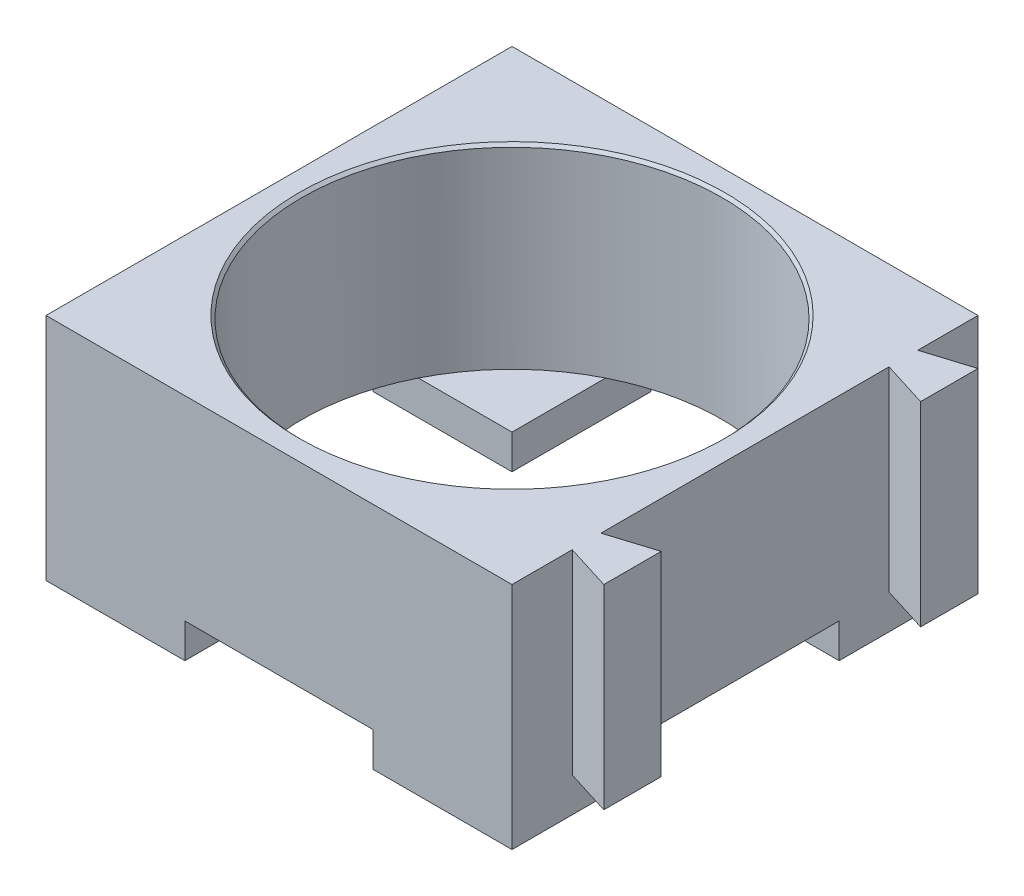
ISO-10303-21;
HEADER;
FILE_DESCRIPTION(('STEP AP214'),'2;1');
FILE_NAME('part.step','',(''),(''),'','','');
FILE_SCHEMA(('AUTOMOTIVE_DESIGN { 1 0 10303 214 1 1 1 1 }'));
ENDSEC;
DATA;
#1=APPLICATION_CONTEXT('core data for automotive mechanical design processes');
#2=APPLICATION_PROTOCOL_DEFINITION('international standard','automotive_design',2000,#1);
#3=PRODUCT_CONTEXT('',#1,'mechanical');
#4=PRODUCT('Part','Part','',(#3));
#5=PRODUCT_RELATED_PRODUCT_CATEGORY('part','',(#4));
#6=PRODUCT_DEFINITION_FORMATION('','',#4);
#7=PRODUCT_DEFINITION_CONTEXT('part definition',#1,'design');
#8=PRODUCT_DEFINITION('design','',#6,#7);
#9=PRODUCT_DEFINITION_SHAPE('','',#8);
#10=(LENGTH_UNIT() NAMED_UNIT(*) SI_UNIT(.MILLI.,.METRE.));
#11=(NAMED_UNIT(*) PLANE_ANGLE_UNIT() SI_UNIT($,.RADIAN.));
#12=(NAMED_UNIT(*) SI_UNIT($,.STERADIAN.) SOLID_ANGLE_UNIT());
#13=UNCERTAINTY_MEASURE_WITH_UNIT(LENGTH_MEASURE(1.E-05),#10,'distance_accuracy_value','');
#14=(GEOMETRIC_REPRESENTATION_CONTEXT(3) GLOBAL_UNCERTAINTY_ASSIGNED_CONTEXT((#13)) GLOBAL_UNIT_ASSIGNED_CONTEXT((#10,
#11,#12)) REPRESENTATION_CONTEXT('',''));
#15=CARTESIAN_POINT('',(0.,0.,0.));
#16=DIRECTION('',(0.,0.,1.));
#17=DIRECTION('',(1.,0.,0.));
#18=AXIS2_PLACEMENT_3D('',#15,#16,#17);
#19=CARTESIAN_POINT('',(0.,0.,0.));
#20=DIRECTION('',(0.,1.,0.));
#21=DIRECTION('',(0.,0.,1.));
#22=AXIS2_PLACEMENT_3D('',#19,#20,#21);
#23=PLANE('',#22);
#24=DIRECTION('',(0.,0.,1.));
#25=VECTOR('',#24,1.);
#26=CARTESIAN_POINT('',(10.15,0.,-10.15));
#27=LINE('',#26,#25);
#28=CARTESIAN_POINT('',(10.15,0.,-7.525));
#29=VERTEX_POINT('',#28);
#30=CARTESIAN_POINT('',(10.15,0.,-6.275));
#31=VERTEX_POINT('',#30);
#32=EDGE_CURVE('E489',#29,#31,#27,.T.);
#33=ORIENTED_EDGE('',*,*,#32,.F.);
#34=DIRECTION('',(-0.954479978035031,0.,0.298274993135942));
#35=VECTOR('',#34,1.);
#36=CARTESIAN_POINT('',(12.15,0.,-8.15));
#37=LINE('',#36,#35);
#38=CARTESIAN_POINT('',(12.15,0.,-8.15));
#39=VERTEX_POINT('',#38);
#40=EDGE_CURVE('E376',#39,#29,#37,.T.);
#41=ORIENTED_EDGE('',*,*,#40,.F.);
#42=DIRECTION('',(0.,0.,-1.));
#43=VECTOR('',#42,1.);
#44=CARTESIAN_POINT('',(12.15,0.,-8.15));
#45=LINE('',#44,#43);
#46=CARTESIAN_POINT('',(12.15,0.,-5.65));
#47=VERTEX_POINT('',#46);
#48=EDGE_CURVE('E374',#47,#39,#45,.T.);
#49=ORIENTED_EDGE('',*,*,#48,.F.);
#50=DIRECTION('',(0.954479978035029,0.,0.298274993135948));
#51=VECTOR('',#50,1.);
#52=CARTESIAN_POINT('',(12.15,0.,-5.65));
#53=LINE('',#52,#51);
#54=EDGE_CURVE('E372',#31,#47,#53,.T.);
#55=ORIENTED_EDGE('',*,*,#54,.F.);
#56=EDGE_LOOP('',(#33,#41,#49,#55));
#57=FACE_BOUND('',#56,.T.);
#58=ADVANCED_FACE('F33',(#57),#23,.F.);
#59=DIRECTION('',(-1.,0.,0.));
#60=VECTOR('',#59,1.);
#61=CARTESIAN_POINT('',(10.15,0.,-4.1));
#62=LINE('',#61,#60);
#63=CARTESIAN_POINT('',(10.15,0.,-4.1));
#64=VERTEX_POINT('',#63);
#65=CARTESIAN_POINT('',(8.18000611246715,0.,-4.1));
#66=VERTEX_POINT('',#65);
#67=EDGE_CURVE('E48',#64,#66,#62,.T.);
#68=ORIENTED_EDGE('',*,*,#67,.F.);
#69=DIRECTION('',(0.,0.,-1.));
#70=VECTOR('',#69,1.);
#71=CARTESIAN_POINT('',(10.15,0.,-6.275));
#72=LINE('',#71,#70);
#73=CARTESIAN_POINT('',(10.15,0.,4.1));
#74=VERTEX_POINT('',#73);
#75=EDGE_CURVE('E244',#74,#64,#72,.T.);
#76=ORIENTED_EDGE('',*,*,#75,.F.);
#77=DIRECTION('',(1.,0.,0.));
#78=VECTOR('',#77,1.);
#79=CARTESIAN_POINT('',(10.15,0.,4.1));
#80=LINE('',#79,#78);
#81=CARTESIAN_POINT('',(8.18000611246715,0.,4.1));
#82=VERTEX_POINT('',#81);
#83=EDGE_CURVE('E268',#82,#74,#80,.T.);
#84=ORIENTED_EDGE('',*,*,#83,.F.);
#85=CARTESIAN_POINT('',(0.,0.,0.));
#86=DIRECTION('',(0.,1.,0.));
#87=DIRECTION('',(0.,0.,1.));
#88=AXIS2_PLACEMENT_3D('',#85,#86,#87);
#89=CIRCLE('',#88,9.14999999999999);
#90=EDGE_CURVE('E453',#82,#66,#89,.T.);
#91=ORIENTED_EDGE('',*,*,#90,.T.);
#92=EDGE_LOOP('',(#68,#76,#84,#91));
#93=FACE_BOUND('',#92,.T.);
#94=ADVANCED_FACE('F485',(#93),#23,.F.);
#95=DIRECTION('',(0.,0.,-1.));
#96=VECTOR('',#95,1.);
#97=CARTESIAN_POINT('',(4.1,0.,-10.15));
#98=LINE('',#97,#96);
#99=CARTESIAN_POINT('',(4.1,0.,-8.18000611246714));
#100=VERTEX_POINT('',#99);
#101=CARTESIAN_POINT('',(4.1,0.,-10.15));
#102=VERTEX_POINT('',#101);
#103=EDGE_CURVE('E478',#100,#102,#98,.T.);
#104=ORIENTED_EDGE('',*,*,#103,.F.);
#105=CARTESIAN_POINT('',(-4.1,0.,-8.18000611246715));
#106=VERTEX_POINT('',#105);
#107=EDGE_CURVE('E337',#100,#106,#89,.T.);
#108=ORIENTED_EDGE('',*,*,#107,.T.);
#109=DIRECTION('',(0.,0.,1.));
#110=VECTOR('',#109,1.);
#111=CARTESIAN_POINT('',(-4.1,0.,-10.15));
#112=LINE('',#111,#110);
#113=CARTESIAN_POINT('',(-4.1,0.,-10.15));
#114=VERTEX_POINT('',#113);
#115=EDGE_CURVE('E290',#114,#106,#112,.T.);
#116=ORIENTED_EDGE('',*,*,#115,.F.);
#117=DIRECTION('',(-1.,0.,0.));
#118=VECTOR('',#117,1.);
#119=CARTESIAN_POINT('',(-10.15,0.,-10.15));
#120=LINE('',#119,#118);
#121=EDGE_CURVE('E56',#102,#114,#120,.T.);
#122=ORIENTED_EDGE('',*,*,#121,.F.);
#123=EDGE_LOOP('',(#104,#108,#116,#122));
#124=FACE_BOUND('',#123,.T.);
#125=ADVANCED_FACE('F477',(#124),#23,.F.);
#126=DIRECTION('',(0.,0.,1.));
#127=VECTOR('',#126,1.);
#128=CARTESIAN_POINT('',(10.15,0.,10.15));
#129=LINE('',#128,#127);
#130=CARTESIAN_POINT('',(10.15,0.,6.275));
#131=VERTEX_POINT('',#130);
#132=CARTESIAN_POINT('',(10.15,0.,7.525));
#133=VERTEX_POINT('',#132);
#134=EDGE_CURVE('E245',#131,#133,#129,.T.);
#135=ORIENTED_EDGE('',*,*,#134,.F.);
#136=DIRECTION('',(-0.954479978035036,0.,0.298274993135925));
#137=VECTOR('',#136,1.);
#138=CARTESIAN_POINT('',(12.1500000000001,0.,5.65));
#139=LINE('',#138,#137);
#140=CARTESIAN_POINT('',(12.1500000000001,0.,5.65));
#141=VERTEX_POINT('',#140);
#142=EDGE_CURVE('E368',#141,#131,#139,.T.);
#143=ORIENTED_EDGE('',*,*,#142,.F.);
#144=DIRECTION('',(0.,0.,-1.));
#145=VECTOR('',#144,1.);
#146=CARTESIAN_POINT('',(12.1500000000001,0.,5.65));
#147=LINE('',#146,#145);
#148=CARTESIAN_POINT('',(12.15,0.,8.15000000000001));
#149=VERTEX_POINT('',#148);
#150=EDGE_CURVE('E366',#149,#141,#147,.T.);
#151=ORIENTED_EDGE('',*,*,#150,.F.);
#152=DIRECTION('',(0.954479978035028,0.,0.298274993135951));
#153=VECTOR('',#152,1.);
#154=CARTESIAN_POINT('',(12.15,0.,8.15000000000001));
#155=LINE('',#154,#153);
#156=EDGE_CURVE('E335',#133,#149,#155,.T.);
#157=ORIENTED_EDGE('',*,*,#156,.F.);
#158=EDGE_LOOP('',(#135,#143,#151,#157));
#159=FACE_BOUND('',#158,.T.);
#160=ADVANCED_FACE('F532',(#159),#23,.F.);
#161=DIRECTION('',(0.,0.,-1.));
#162=VECTOR('',#161,1.);
#163=CARTESIAN_POINT('',(4.1,0.,10.15));
#164=LINE('',#163,#162);
#165=CARTESIAN_POINT('',(4.1,0.,10.15));
#166=VERTEX_POINT('',#165);
#167=CARTESIAN_POINT('',(4.1,0.,8.18000611246715));
#168=VERTEX_POINT('',#167);
#169=EDGE_CURVE('E265',#166,#168,#164,.T.);
#170=ORIENTED_EDGE('',*,*,#169,.F.);
#171=DIRECTION('',(1.,0.,0.));
#172=VECTOR('',#171,1.);
#173=CARTESIAN_POINT('',(-10.15,0.,10.15));
#174=LINE('',#173,#172);
#175=CARTESIAN_POINT('',(-4.1,0.,10.15));
#176=VERTEX_POINT('',#175);
#177=EDGE_CURVE('E342',#176,#166,#174,.T.);
#178=ORIENTED_EDGE('',*,*,#177,.F.);
#179=DIRECTION('',(0.,0.,1.));
#180=VECTOR('',#179,1.);
#181=CARTESIAN_POINT('',(-4.1,0.,10.15));
#182=LINE('',#181,#180);
#183=CARTESIAN_POINT('',(-4.1,0.,8.18000611246714));
#184=VERTEX_POINT('',#183);
#185=EDGE_CURVE('E322',#184,#176,#182,.T.);
#186=ORIENTED_EDGE('',*,*,#185,.F.);
#187=EDGE_CURVE('E336',#184,#168,#89,.T.);
#188=ORIENTED_EDGE('',*,*,#187,.T.);
#189=EDGE_LOOP('',(#170,#178,#186,#188));
#190=FACE_BOUND('',#189,.T.);
#191=ADVANCED_FACE('F553',(#190),#23,.F.);
#192=DIRECTION('',(-1.,0.,0.));
#193=VECTOR('',#192,1.);
#194=CARTESIAN_POINT('',(-10.15,0.,-4.1));
#195=LINE('',#194,#193);
#196=CARTESIAN_POINT('',(-8.18000611246715,0.,-4.1));
#197=VERTEX_POINT('',#196);
#198=CARTESIAN_POINT('',(-10.15,0.,-4.1));
#199=VERTEX_POINT('',#198);
#200=EDGE_CURVE('E293',#197,#199,#195,.T.);
#201=ORIENTED_EDGE('',*,*,#200,.F.);
#202=CARTESIAN_POINT('',(-8.18000611246715,0.,4.1));
#203=VERTEX_POINT('',#202);
#204=EDGE_CURVE('E331',#197,#203,#89,.T.);
#205=ORIENTED_EDGE('',*,*,#204,.T.);
#206=DIRECTION('',(1.,0.,0.));
#207=VECTOR('',#206,1.);
#208=CARTESIAN_POINT('',(-10.15,0.,4.1));
#209=LINE('',#208,#207);
#210=CARTESIAN_POINT('',(-10.15,0.,4.1));
#211=VERTEX_POINT('',#210);
#212=EDGE_CURVE('E317',#211,#203,#209,.T.);
#213=ORIENTED_EDGE('',*,*,#212,.F.);
#214=DIRECTION('',(0.,0.,1.));
#215=VECTOR('',#214,1.);
#216=CARTESIAN_POINT('',(-10.15,0.,-10.15));
#217=LINE('',#216,#215);
#218=EDGE_CURVE('E380',#199,#211,#217,.T.);
#219=ORIENTED_EDGE('',*,*,#218,.F.);
#220=EDGE_LOOP('',(#201,#205,#213,#219));
#221=FACE_BOUND('',#220,.T.);
#222=ADVANCED_FACE('F460',(#221),#23,.F.);
#223=CARTESIAN_POINT('',(0.,8.5,0.));
#224=DIRECTION('',(0.,1.,0.));
#225=DIRECTION('',(0.,0.,1.));
#226=AXIS2_PLACEMENT_3D('',#223,#224,#225);
#227=PLANE('',#226);
#228=CARTESIAN_POINT('',(0.,8.5,0.));
#229=DIRECTION('',(0.,1.,0.));
#230=DIRECTION('',(0.,0.,1.));
#231=AXIS2_PLACEMENT_3D('',#228,#229,#230);
#232=CIRCLE('',#231,9.275);
#233=CARTESIAN_POINT('',(0.,8.5,9.275));
#234=VERTEX_POINT('',#233);
#235=EDGE_CURVE('E11',#234,#234,#232,.F.);
#236=ORIENTED_EDGE('',*,*,#235,.T.);
#237=EDGE_LOOP('',(#236));
#238=FACE_BOUND('',#237,.T.);
#239=DIRECTION('',(0.,0.,-1.));
#240=VECTOR('',#239,1.);
#241=CARTESIAN_POINT('',(10.15,8.5,7.525));
#242=LINE('',#241,#240);
#243=CARTESIAN_POINT('',(10.15,8.5,10.15));
#244=VERTEX_POINT('',#243);
#245=CARTESIAN_POINT('',(10.15,8.5,7.525));
#246=VERTEX_POINT('',#245);
#247=EDGE_CURVE('E338',#244,#246,#242,.T.);
#248=ORIENTED_EDGE('',*,*,#247,.T.);
#249=DIRECTION('',(0.954479978035028,0.,0.298274993135951));
#250=VECTOR('',#249,1.);
#251=CARTESIAN_POINT('',(12.15,8.5,8.15000000000001));
#252=LINE('',#251,#250);
#253=CARTESIAN_POINT('',(12.15,8.5,8.15000000000001));
#254=VERTEX_POINT('',#253);
#255=EDGE_CURVE('E341',#246,#254,#252,.T.);
#256=ORIENTED_EDGE('',*,*,#255,.T.);
#257=DIRECTION('',(0.,0.,-1.));
#258=VECTOR('',#257,1.);
#259=CARTESIAN_POINT('',(12.1500000000001,8.5,5.65));
#260=LINE('',#259,#258);
#261=CARTESIAN_POINT('',(12.1500000000001,8.5,5.65));
#262=VERTEX_POINT('',#261);
#263=EDGE_CURVE('E344',#254,#262,#260,.T.);
#264=ORIENTED_EDGE('',*,*,#263,.T.);
#265=DIRECTION('',(-0.954479978035036,0.,0.298274993135925));
#266=VECTOR('',#265,1.);
#267=CARTESIAN_POINT('',(12.1500000000001,8.5,5.65));
#268=LINE('',#267,#266);
#269=CARTESIAN_POINT('',(10.15,8.5,6.275));
#270=VERTEX_POINT('',#269);
#271=EDGE_CURVE('E346',#262,#270,#268,.T.);
#272=ORIENTED_EDGE('',*,*,#271,.T.);
#273=DIRECTION('',(0.,0.,-1.));
#274=VECTOR('',#273,1.);
#275=CARTESIAN_POINT('',(10.15,8.5,-6.275));
#276=LINE('',#275,#274);
#277=CARTESIAN_POINT('',(10.15,8.5,-6.275));
#278=VERTEX_POINT('',#277);
#279=EDGE_CURVE('E348',#270,#278,#276,.T.);
#280=ORIENTED_EDGE('',*,*,#279,.T.);
#281=DIRECTION('',(0.954479978035029,0.,0.298274993135948));
#282=VECTOR('',#281,1.);
#283=CARTESIAN_POINT('',(12.15,8.5,-5.65));
#284=LINE('',#283,#282);
#285=CARTESIAN_POINT('',(12.15,8.5,-5.65));
#286=VERTEX_POINT('',#285);
#287=EDGE_CURVE('E350',#278,#286,#284,.T.);
#288=ORIENTED_EDGE('',*,*,#287,.T.);
#289=DIRECTION('',(0.,0.,-1.));
#290=VECTOR('',#289,1.);
#291=CARTESIAN_POINT('',(12.15,8.5,-8.15));
#292=LINE('',#291,#290);
#293=CARTESIAN_POINT('',(12.15,8.5,-8.15));
#294=VERTEX_POINT('',#293);
#295=EDGE_CURVE('E352',#286,#294,#292,.T.);
#296=ORIENTED_EDGE('',*,*,#295,.T.);
#297=DIRECTION('',(-0.954479978035031,0.,0.298274993135942));
#298=VECTOR('',#297,1.);
#299=CARTESIAN_POINT('',(12.15,8.5,-8.15));
#300=LINE('',#299,#298);
#301=CARTESIAN_POINT('',(10.15,8.5,-7.525));
#302=VERTEX_POINT('',#301);
#303=EDGE_CURVE('E354',#294,#302,#300,.T.);
#304=ORIENTED_EDGE('',*,*,#303,.T.);
#305=DIRECTION('',(0.,0.,-1.));
#306=VECTOR('',#305,1.);
#307=CARTESIAN_POINT('',(10.15,8.5,-10.15));
#308=LINE('',#307,#306);
#309=CARTESIAN_POINT('',(10.15,8.5,-10.15));
#310=VERTEX_POINT('',#309);
#311=EDGE_CURVE('E356',#302,#310,#308,.T.);
#312=ORIENTED_EDGE('',*,*,#311,.T.);
#313=DIRECTION('',(-1.,0.,0.));
#314=VECTOR('',#313,1.);
#315=CARTESIAN_POINT('',(-10.15,8.5,-10.15));
#316=LINE('',#315,#314);
#317=CARTESIAN_POINT('',(-10.15,8.5,-10.15));
#318=VERTEX_POINT('',#317);
#319=EDGE_CURVE('E358',#310,#318,#316,.T.);
#320=ORIENTED_EDGE('',*,*,#319,.T.);
#321=DIRECTION('',(0.,0.,1.));
#322=VECTOR('',#321,1.);
#323=CARTESIAN_POINT('',(-10.15,8.5,-10.15));
#324=LINE('',#323,#322);
#325=CARTESIAN_POINT('',(-10.15,8.5,10.15));
#326=VERTEX_POINT('',#325);
#327=EDGE_CURVE('E360',#318,#326,#324,.T.);
#328=ORIENTED_EDGE('',*,*,#327,.T.);
#329=DIRECTION('',(1.,0.,0.));
#330=VECTOR('',#329,1.);
#331=CARTESIAN_POINT('',(-10.15,8.5,10.15));
#332=LINE('',#331,#330);
#333=EDGE_CURVE('E362',#326,#244,#332,.T.);
#334=ORIENTED_EDGE('',*,*,#333,.T.);
#335=EDGE_LOOP('',(#248,#256,#264,#272,#280,#288,#296,#304,#312,#320,#328,#334));
#336=FACE_BOUND('',#335,.T.);
#337=ADVANCED_FACE('F506',(#238,#336),#227,.T.);
#338=CARTESIAN_POINT('',(12.15,8.5,8.15000000000001));
#339=DIRECTION('',(0.298274993135951,0.,-0.954479978035029));
#340=DIRECTION('',(-0.954479978035029,0.,-0.298274993135951));
#341=AXIS2_PLACEMENT_3D('',#338,#339,#340);
#342=PLANE('',#341);
#343=ORIENTED_EDGE('',*,*,#156,.T.);
#344=DIRECTION('',(0.,-1.,0.));
#345=VECTOR('',#344,1.);
#346=CARTESIAN_POINT('',(12.15,8.5,8.15000000000001));
#347=LINE('',#346,#345);
#348=EDGE_CURVE('E407',#254,#149,#347,.T.);
#349=ORIENTED_EDGE('',*,*,#348,.F.);
#350=ORIENTED_EDGE('',*,*,#255,.F.);
#351=DIRECTION('',(0.,-1.,0.));
#352=VECTOR('',#351,1.);
#353=CARTESIAN_POINT('',(10.15,8.5,7.525));
#354=LINE('',#353,#352);
#355=EDGE_CURVE('E410',#246,#133,#354,.T.);
#356=ORIENTED_EDGE('',*,*,#355,.T.);
#357=EDGE_LOOP('',(#343,#349,#350,#356));
#358=FACE_BOUND('',#357,.T.);
#359=ADVANCED_FACE('F536',(#358),#342,.F.);
#360=CARTESIAN_POINT('',(12.1500000000001,8.5,5.65));
#361=DIRECTION('',(-1.,0.,0.));
#362=DIRECTION('',(0.,0.,1.));
#363=AXIS2_PLACEMENT_3D('',#360,#361,#362);
#364=PLANE('',#363);
#365=ORIENTED_EDGE('',*,*,#150,.T.);
#366=DIRECTION('',(0.,-1.,0.));
#367=VECTOR('',#366,1.);
#368=CARTESIAN_POINT('',(12.1500000000001,8.5,5.65));
#369=LINE('',#368,#367);
#370=EDGE_CURVE('E404',#262,#141,#369,.T.);
#371=ORIENTED_EDGE('',*,*,#370,.F.);
#372=ORIENTED_EDGE('',*,*,#263,.F.);
#373=ORIENTED_EDGE('',*,*,#348,.T.);
#374=EDGE_LOOP('',(#365,#371,#372,#373));
#375=FACE_BOUND('',#374,.T.);
#376=ADVANCED_FACE('F598',(#375),#364,.F.);
#377=CARTESIAN_POINT('',(12.1500000000001,8.5,5.65));
#378=DIRECTION('',(0.298274993135925,0.,0.954479978035037));
#379=DIRECTION('',(0.954479978035037,0.,-0.298274993135925));
#380=AXIS2_PLACEMENT_3D('',#377,#378,#379);
#381=PLANE('',#380);
#382=ORIENTED_EDGE('',*,*,#142,.T.);
#383=DIRECTION('',(0.,-1.,0.));
#384=VECTOR('',#383,1.);
#385=CARTESIAN_POINT('',(10.15,8.5,6.275));
#386=LINE('',#385,#384);
#387=EDGE_CURVE('E401',#270,#131,#386,.T.);
#388=ORIENTED_EDGE('',*,*,#387,.F.);
#389=ORIENTED_EDGE('',*,*,#271,.F.);
#390=ORIENTED_EDGE('',*,*,#370,.T.);
#391=EDGE_LOOP('',(#382,#388,#389,#390));
#392=FACE_BOUND('',#391,.T.);
#393=ADVANCED_FACE('F527',(#392),#381,.F.);
#394=CARTESIAN_POINT('',(12.15,8.5,-5.65));
#395=DIRECTION('',(0.298274993135948,0.,-0.954479978035029));
#396=DIRECTION('',(-0.954479978035029,0.,-0.298274993135948));
#397=AXIS2_PLACEMENT_3D('',#394,#395,#396);
#398=PLANE('',#397);
#399=ORIENTED_EDGE('',*,*,#54,.T.);
#400=DIRECTION('',(0.,-1.,0.));
#401=VECTOR('',#400,1.);
#402=CARTESIAN_POINT('',(12.15,8.5,-5.65));
#403=LINE('',#402,#401);
#404=EDGE_CURVE('E396',#286,#47,#403,.T.);
#405=ORIENTED_EDGE('',*,*,#404,.F.);
#406=ORIENTED_EDGE('',*,*,#287,.F.);
#407=DIRECTION('',(0.,-1.,0.));
#408=VECTOR('',#407,1.);
#409=CARTESIAN_POINT('',(10.15,8.5,-6.275));
#410=LINE('',#409,#408);
#411=EDGE_CURVE('E399',#278,#31,#410,.T.);
#412=ORIENTED_EDGE('',*,*,#411,.T.);
#413=EDGE_LOOP('',(#399,#405,#406,#412));
#414=FACE_BOUND('',#413,.T.);
#415=ADVANCED_FACE('F521',(#414),#398,.F.);
#416=CARTESIAN_POINT('',(12.15,8.5,-8.15));
#417=DIRECTION('',(-1.,0.,0.));
#418=DIRECTION('',(0.,0.,1.));
#419=AXIS2_PLACEMENT_3D('',#416,#417,#418);
#420=PLANE('',#419);
#421=ORIENTED_EDGE('',*,*,#48,.T.);
#422=DIRECTION('',(0.,-1.,0.));
#423=VECTOR('',#422,1.);
#424=CARTESIAN_POINT('',(12.15,8.5,-8.15));
#425=LINE('',#424,#423);
#426=EDGE_CURVE('E393',#294,#39,#425,.T.);
#427=ORIENTED_EDGE('',*,*,#426,.F.);
#428=ORIENTED_EDGE('',*,*,#295,.F.);
#429=ORIENTED_EDGE('',*,*,#404,.T.);
#430=EDGE_LOOP('',(#421,#427,#428,#429));
#431=FACE_BOUND('',#430,.T.);
#432=ADVANCED_FACE('F617',(#431),#420,.F.);
#433=CARTESIAN_POINT('',(12.15,8.5,-8.15));
#434=DIRECTION('',(0.298274993135942,0.,0.954479978035031));
#435=DIRECTION('',(0.954479978035031,0.,-0.298274993135942));
#436=AXIS2_PLACEMENT_3D('',#433,#434,#435);
#437=PLANE('',#436);
#438=ORIENTED_EDGE('',*,*,#40,.T.);
#439=DIRECTION('',(0.,-1.,0.));
#440=VECTOR('',#439,1.);
#441=CARTESIAN_POINT('',(10.15,8.5,-7.525));
#442=LINE('',#441,#440);
#443=EDGE_CURVE('E391',#302,#29,#442,.T.);
#444=ORIENTED_EDGE('',*,*,#443,.F.);
#445=ORIENTED_EDGE('',*,*,#303,.F.);
#446=ORIENTED_EDGE('',*,*,#426,.T.);
#447=EDGE_LOOP('',(#438,#444,#445,#446));
#448=FACE_BOUND('',#447,.T.);
#449=ADVANCED_FACE('F511',(#448),#437,.F.);
#450=CARTESIAN_POINT('',(10.15,8.5,-10.15));
#451=DIRECTION('',(-1.,0.,0.));
#452=DIRECTION('',(0.,0.,1.));
#453=AXIS2_PLACEMENT_3D('',#450,#451,#452);
#454=PLANE('',#453);
#455=ORIENTED_EDGE('',*,*,#443,.T.);
#456=ORIENTED_EDGE('',*,*,#32,.T.);
#457=ORIENTED_EDGE('',*,*,#411,.F.);
#458=ORIENTED_EDGE('',*,*,#279,.F.);
#459=ORIENTED_EDGE('',*,*,#387,.T.);
#460=ORIENTED_EDGE('',*,*,#134,.T.);
#461=ORIENTED_EDGE('',*,*,#355,.F.);
#462=ORIENTED_EDGE('',*,*,#247,.F.);
#463=DIRECTION('',(0.,-1.,0.));
#464=VECTOR('',#463,1.);
#465=CARTESIAN_POINT('',(10.15,8.5,10.15));
#466=LINE('',#465,#464);
#467=CARTESIAN_POINT('',(10.15,-1.5,10.15));
#468=VERTEX_POINT('',#467);
#469=EDGE_CURVE('E364',#244,#468,#466,.T.);
#470=ORIENTED_EDGE('',*,*,#469,.T.);
#471=DIRECTION('',(0.,0.,1.));
#472=VECTOR('',#471,1.);
#473=CARTESIAN_POINT('',(10.15,-1.5,10.15));
#474=LINE('',#473,#472);
#475=CARTESIAN_POINT('',(10.15,-1.5,4.1));
#476=VERTEX_POINT('',#475);
#477=EDGE_CURVE('E254',#476,#468,#474,.T.);
#478=ORIENTED_EDGE('',*,*,#477,.F.);
#479=DIRECTION('',(0.,1.,0.));
#480=VECTOR('',#479,1.);
#481=CARTESIAN_POINT('',(10.15,-1.5,4.1));
#482=LINE('',#481,#480);
#483=EDGE_CURVE('E263',#476,#74,#482,.T.);
#484=ORIENTED_EDGE('',*,*,#483,.T.);
#485=ORIENTED_EDGE('',*,*,#75,.T.);
#486=DIRECTION('',(0.,1.,0.));
#487=VECTOR('',#486,1.);
#488=CARTESIAN_POINT('',(10.15,-1.5,-4.1));
#489=LINE('',#488,#487);
#490=CARTESIAN_POINT('',(10.15,-1.5,-4.1));
#491=VERTEX_POINT('',#490);
#492=EDGE_CURVE('E224',#491,#64,#489,.T.);
#493=ORIENTED_EDGE('',*,*,#492,.F.);
#494=DIRECTION('',(0.,0.,1.));
#495=VECTOR('',#494,1.);
#496=CARTESIAN_POINT('',(10.15,-1.5,-10.15));
#497=LINE('',#496,#495);
#498=CARTESIAN_POINT('',(10.15,-1.5,-10.15));
#499=VERTEX_POINT('',#498);
#500=EDGE_CURVE('E230',#499,#491,#497,.T.);
#501=ORIENTED_EDGE('',*,*,#500,.F.);
#502=DIRECTION('',(0.,-1.,0.));
#503=VECTOR('',#502,1.);
#504=CARTESIAN_POINT('',(10.15,8.5,-10.15));
#505=LINE('',#504,#503);
#506=EDGE_CURVE('E389',#310,#499,#505,.T.);
#507=ORIENTED_EDGE('',*,*,#506,.F.);
#508=ORIENTED_EDGE('',*,*,#311,.F.);
#509=EDGE_LOOP('',(#455,#456,#457,#458,#459,#460,#461,#462,#470,#478,#484,#485,#493,#501,#507,#508));
#510=FACE_BOUND('',#509,.T.);
#511=ADVANCED_FACE('F242',(#510),#454,.F.);
#512=CARTESIAN_POINT('',(-10.15,8.5,-10.15));
#513=DIRECTION('',(0.,0.,1.));
#514=DIRECTION('',(1.,0.,0.));
#515=AXIS2_PLACEMENT_3D('',#512,#513,#514);
#516=PLANE('',#515);
#517=ORIENTED_EDGE('',*,*,#506,.T.);
#518=DIRECTION('',(1.,0.,0.));
#519=VECTOR('',#518,1.);
#520=CARTESIAN_POINT('',(10.15,-1.5,-10.15));
#521=LINE('',#520,#519);
#522=CARTESIAN_POINT('',(4.1,-1.5,-10.15));
#523=VERTEX_POINT('',#522);
#524=EDGE_CURVE('E236',#523,#499,#521,.T.);
#525=ORIENTED_EDGE('',*,*,#524,.F.);
#526=DIRECTION('',(0.,1.,0.));
#527=VECTOR('',#526,1.);
#528=CARTESIAN_POINT('',(4.1,-1.5,-10.15));
#529=LINE('',#528,#527);
#530=EDGE_CURVE('E250',#523,#102,#529,.T.);
#531=ORIENTED_EDGE('',*,*,#530,.T.);
#532=ORIENTED_EDGE('',*,*,#121,.T.);
#533=DIRECTION('',(0.,1.,0.));
#534=VECTOR('',#533,1.);
#535=CARTESIAN_POINT('',(-4.1,-1.5,-10.15));
#536=LINE('',#535,#534);
#537=CARTESIAN_POINT('',(-4.1,-1.5,-10.15));
#538=VERTEX_POINT('',#537);
#539=EDGE_CURVE('E301',#538,#114,#536,.T.);
#540=ORIENTED_EDGE('',*,*,#539,.F.);
#541=DIRECTION('',(1.,0.,0.));
#542=VECTOR('',#541,1.);
#543=CARTESIAN_POINT('',(-10.15,-1.5,-10.15));
#544=LINE('',#543,#542);
#545=CARTESIAN_POINT('',(-10.15,-1.5,-10.15));
#546=VERTEX_POINT('',#545);
#547=EDGE_CURVE('E282',#546,#538,#544,.T.);
#548=ORIENTED_EDGE('',*,*,#547,.F.);
#549=DIRECTION('',(0.,-1.,0.));
#550=VECTOR('',#549,1.);
#551=CARTESIAN_POINT('',(-10.15,8.5,-10.15));
#552=LINE('',#551,#550);
#553=EDGE_CURVE('E387',#318,#546,#552,.T.);
#554=ORIENTED_EDGE('',*,*,#553,.F.);
#555=ORIENTED_EDGE('',*,*,#319,.F.);
#556=EDGE_LOOP('',(#517,#525,#531,#532,#540,#548,#554,#555));
#557=FACE_BOUND('',#556,.T.);
#558=ADVANCED_FACE('F500',(#557),#516,.F.);
#559=CARTESIAN_POINT('',(-10.15,8.5,-10.15));
#560=DIRECTION('',(1.,0.,0.));
#561=DIRECTION('',(0.,0.,-1.));
#562=AXIS2_PLACEMENT_3D('',#559,#560,#561);
#563=PLANE('',#562);
#564=ORIENTED_EDGE('',*,*,#553,.T.);
#565=DIRECTION('',(0.,0.,-1.));
#566=VECTOR('',#565,1.);
#567=CARTESIAN_POINT('',(-10.15,-1.5,-10.15));
#568=LINE('',#567,#566);
#569=CARTESIAN_POINT('',(-10.15,-1.5,-4.1));
#570=VERTEX_POINT('',#569);
#571=EDGE_CURVE('E279',#570,#546,#568,.T.);
#572=ORIENTED_EDGE('',*,*,#571,.F.);
#573=DIRECTION('',(0.,1.,0.));
#574=VECTOR('',#573,1.);
#575=CARTESIAN_POINT('',(-10.15,-1.5,-4.1));
#576=LINE('',#575,#574);
#577=EDGE_CURVE('E289',#570,#199,#576,.T.);
#578=ORIENTED_EDGE('',*,*,#577,.T.);
#579=ORIENTED_EDGE('',*,*,#218,.T.);
#580=DIRECTION('',(0.,1.,0.));
#581=VECTOR('',#580,1.);
#582=CARTESIAN_POINT('',(-10.15,-1.5,4.1));
#583=LINE('',#582,#581);
#584=CARTESIAN_POINT('',(-10.15,-1.5,4.1));
#585=VERTEX_POINT('',#584);
#586=EDGE_CURVE('E328',#585,#211,#583,.T.);
#587=ORIENTED_EDGE('',*,*,#586,.F.);
#588=DIRECTION('',(0.,0.,-1.));
#589=VECTOR('',#588,1.);
#590=CARTESIAN_POINT('',(-10.15,-1.5,10.15));
#591=LINE('',#590,#589);
#592=CARTESIAN_POINT('',(-10.15,-1.5,10.15));
#593=VERTEX_POINT('',#592);
#594=EDGE_CURVE('E305',#593,#585,#591,.T.);
#595=ORIENTED_EDGE('',*,*,#594,.F.);
#596=DIRECTION('',(0.,-1.,0.));
#597=VECTOR('',#596,1.);
#598=CARTESIAN_POINT('',(-10.15,8.5,10.15));
#599=LINE('',#598,#597);
#600=EDGE_CURVE('E385',#326,#593,#599,.T.);
#601=ORIENTED_EDGE('',*,*,#600,.F.);
#602=ORIENTED_EDGE('',*,*,#327,.F.);
#603=EDGE_LOOP('',(#564,#572,#578,#579,#587,#595,#601,#602));
#604=FACE_BOUND('',#603,.T.);
#605=ADVANCED_FACE('F435',(#604),#563,.F.);
#606=CARTESIAN_POINT('',(-10.15,8.5,10.15));
#607=DIRECTION('',(0.,0.,-1.));
#608=DIRECTION('',(-1.,0.,0.));
#609=AXIS2_PLACEMENT_3D('',#606,#607,#608);
#610=PLANE('',#609);
#611=ORIENTED_EDGE('',*,*,#600,.T.);
#612=DIRECTION('',(-1.,0.,0.));
#613=VECTOR('',#612,1.);
#614=CARTESIAN_POINT('',(-10.15,-1.5,10.15));
#615=LINE('',#614,#613);
#616=CARTESIAN_POINT('',(-4.1,-1.5,10.15));
#617=VERTEX_POINT('',#616);
#618=EDGE_CURVE('E313',#617,#593,#615,.T.);
#619=ORIENTED_EDGE('',*,*,#618,.F.);
#620=DIRECTION('',(0.,1.,0.));
#621=VECTOR('',#620,1.);
#622=CARTESIAN_POINT('',(-4.1,-1.5,10.15));
#623=LINE('',#622,#621);
#624=EDGE_CURVE('E316',#617,#176,#623,.T.);
#625=ORIENTED_EDGE('',*,*,#624,.T.);
#626=ORIENTED_EDGE('',*,*,#177,.T.);
#627=DIRECTION('',(0.,1.,0.));
#628=VECTOR('',#627,1.);
#629=CARTESIAN_POINT('',(4.1,-1.5,10.15));
#630=LINE('',#629,#628);
#631=CARTESIAN_POINT('',(4.1,-1.5,10.15));
#632=VERTEX_POINT('',#631);
#633=EDGE_CURVE('E275',#632,#166,#630,.T.);
#634=ORIENTED_EDGE('',*,*,#633,.F.);
#635=DIRECTION('',(-1.,0.,0.));
#636=VECTOR('',#635,1.);
#637=CARTESIAN_POINT('',(10.15,-1.5,10.15));
#638=LINE('',#637,#636);
#639=EDGE_CURVE('E257',#468,#632,#638,.T.);
#640=ORIENTED_EDGE('',*,*,#639,.F.);
#641=ORIENTED_EDGE('',*,*,#469,.F.);
#642=ORIENTED_EDGE('',*,*,#333,.F.);
#643=EDGE_LOOP('',(#611,#619,#625,#626,#634,#640,#641,#642));
#644=FACE_BOUND('',#643,.T.);
#645=ADVANCED_FACE('F426',(#644),#610,.F.);
#646=CARTESIAN_POINT('',(0.,8.5,0.));
#647=DIRECTION('',(0.,-1.,0.));
#648=DIRECTION('',(0.,0.,-1.));
#649=AXIS2_PLACEMENT_3D('',#646,#647,#648);
#650=CYLINDRICAL_SURFACE('',#649,9.14999999999999);
#651=CARTESIAN_POINT('',(0.,8.37499999999999,0.));
#652=DIRECTION('',(0.,1.,0.));
#653=DIRECTION('',(0.,0.,1.));
#654=AXIS2_PLACEMENT_3D('',#651,#652,#653);
#655=CIRCLE('',#654,9.14999999999999);
#656=CARTESIAN_POINT('',(0.,8.37499999999999,9.14999999999999));
#657=VERTEX_POINT('',#656);
#658=EDGE_CURVE('E41',#657,#657,#655,.T.);
#659=ORIENTED_EDGE('',*,*,#658,.T.);
#660=EDGE_LOOP('',(#659));
#661=FACE_BOUND('',#660,.T.);
#662=EDGE_CURVE('E332',#203,#184,#89,.T.);
#663=ORIENTED_EDGE('',*,*,#662,.F.);
#664=ORIENTED_EDGE('',*,*,#204,.F.);
#665=EDGE_CURVE('E452',#106,#197,#89,.T.);
#666=ORIENTED_EDGE('',*,*,#665,.F.);
#667=ORIENTED_EDGE('',*,*,#107,.F.);
#668=EDGE_CURVE('E458',#66,#100,#89,.T.);
#669=ORIENTED_EDGE('',*,*,#668,.F.);
#670=ORIENTED_EDGE('',*,*,#90,.F.);
#671=EDGE_CURVE('E450',#168,#82,#89,.T.);
#672=ORIENTED_EDGE('',*,*,#671,.F.);
#673=ORIENTED_EDGE('',*,*,#187,.F.);
#674=EDGE_LOOP('',(#663,#664,#666,#667,#669,#670,#672,#673));
#675=FACE_BOUND('',#674,.T.);
#676=ADVANCED_FACE('F446',(#661,#675),#650,.F.);
#677=CARTESIAN_POINT('',(0.,0.,0.));
#678=DIRECTION('',(0.,-1.,0.));
#679=DIRECTION('',(0.,0.,-1.));
#680=AXIS2_PLACEMENT_3D('',#677,#678,#679);
#681=PLANE('',#680);
#682=CARTESIAN_POINT('',(-4.1,0.,4.1));
#683=VERTEX_POINT('',#682);
#684=EDGE_CURVE('E304',#203,#683,#209,.T.);
#685=ORIENTED_EDGE('',*,*,#684,.F.);
#686=ORIENTED_EDGE('',*,*,#662,.T.);
#687=EDGE_CURVE('E309',#683,#184,#182,.T.);
#688=ORIENTED_EDGE('',*,*,#687,.F.);
#689=EDGE_LOOP('',(#685,#686,#688));
#690=FACE_BOUND('',#689,.T.);
#691=ADVANCED_FACE('F443',(#690),#681,.F.);
#692=CARTESIAN_POINT('',(-10.15,-1.5,4.1));
#693=DIRECTION('',(0.,0.,1.));
#694=DIRECTION('',(1.,0.,0.));
#695=AXIS2_PLACEMENT_3D('',#692,#693,#694);
#696=PLANE('',#695);
#697=ORIENTED_EDGE('',*,*,#212,.T.);
#698=ORIENTED_EDGE('',*,*,#684,.T.);
#699=DIRECTION('',(0.,1.,0.));
#700=VECTOR('',#699,1.);
#701=CARTESIAN_POINT('',(-4.1,-1.5,4.1));
#702=LINE('',#701,#700);
#703=CARTESIAN_POINT('',(-4.1,-1.5,4.1));
#704=VERTEX_POINT('',#703);
#705=EDGE_CURVE('E325',#704,#683,#702,.T.);
#706=ORIENTED_EDGE('',*,*,#705,.F.);
#707=DIRECTION('',(1.,0.,0.));
#708=VECTOR('',#707,1.);
#709=CARTESIAN_POINT('',(-10.15,-1.5,4.1));
#710=LINE('',#709,#708);
#711=EDGE_CURVE('E308',#585,#704,#710,.T.);
#712=ORIENTED_EDGE('',*,*,#711,.F.);
#713=ORIENTED_EDGE('',*,*,#586,.T.);
#714=EDGE_LOOP('',(#697,#698,#706,#712,#713));
#715=FACE_BOUND('',#714,.T.);
#716=ADVANCED_FACE('F439',(#715),#696,.F.);
#717=CARTESIAN_POINT('',(-4.1,-1.5,10.15));
#718=DIRECTION('',(-1.,0.,0.));
#719=DIRECTION('',(0.,0.,1.));
#720=AXIS2_PLACEMENT_3D('',#717,#718,#719);
#721=PLANE('',#720);
#722=ORIENTED_EDGE('',*,*,#687,.T.);
#723=ORIENTED_EDGE('',*,*,#185,.T.);
#724=ORIENTED_EDGE('',*,*,#624,.F.);
#725=DIRECTION('',(0.,0.,1.));
#726=VECTOR('',#725,1.);
#727=CARTESIAN_POINT('',(-4.1,-1.5,10.15));
#728=LINE('',#727,#726);
#729=EDGE_CURVE('E311',#704,#617,#728,.T.);
#730=ORIENTED_EDGE('',*,*,#729,.F.);
#731=ORIENTED_EDGE('',*,*,#705,.T.);
#732=EDGE_LOOP('',(#722,#723,#724,#730,#731));
#733=FACE_BOUND('',#732,.T.);
#734=ADVANCED_FACE('F418',(#733),#721,.F.);
#735=CARTESIAN_POINT('',(0.,-1.5,0.));
#736=DIRECTION('',(0.,-1.,0.));
#737=DIRECTION('',(0.,0.,-1.));
#738=AXIS2_PLACEMENT_3D('',#735,#736,#737);
#739=PLANE('',#738);
#740=ORIENTED_EDGE('',*,*,#594,.T.);
#741=ORIENTED_EDGE('',*,*,#711,.T.);
#742=ORIENTED_EDGE('',*,*,#729,.T.);
#743=ORIENTED_EDGE('',*,*,#618,.T.);
#744=EDGE_LOOP('',(#740,#741,#742,#743));
#745=FACE_BOUND('',#744,.T.);
#746=ADVANCED_FACE('F432',(#745),#739,.T.);
#747=CARTESIAN_POINT('',(0.,0.,0.));
#748=DIRECTION('',(0.,1.,0.));
#749=DIRECTION('',(0.,0.,1.));
#750=AXIS2_PLACEMENT_3D('',#747,#748,#749);
#751=PLANE('',#750);
#752=CARTESIAN_POINT('',(-4.1,0.,-4.1));
#753=VERTEX_POINT('',#752);
#754=EDGE_CURVE('E278',#106,#753,#112,.T.);
#755=ORIENTED_EDGE('',*,*,#754,.F.);
#756=ORIENTED_EDGE('',*,*,#665,.T.);
#757=EDGE_CURVE('E283',#753,#197,#195,.T.);
#758=ORIENTED_EDGE('',*,*,#757,.F.);
#759=EDGE_LOOP('',(#755,#756,#758));
#760=FACE_BOUND('',#759,.T.);
#761=ADVANCED_FACE('F475',(#760),#751,.T.);
#762=CARTESIAN_POINT('',(-4.1,-1.5,-10.15));
#763=DIRECTION('',(-1.,0.,0.));
#764=DIRECTION('',(0.,0.,1.));
#765=AXIS2_PLACEMENT_3D('',#762,#763,#764);
#766=PLANE('',#765);
#767=ORIENTED_EDGE('',*,*,#115,.T.);
#768=ORIENTED_EDGE('',*,*,#754,.T.);
#769=DIRECTION('',(0.,1.,0.));
#770=VECTOR('',#769,1.);
#771=CARTESIAN_POINT('',(-4.1,-1.5,-4.1));
#772=LINE('',#771,#770);
#773=CARTESIAN_POINT('',(-4.1,-1.5,-4.1));
#774=VERTEX_POINT('',#773);
#775=EDGE_CURVE('E298',#774,#753,#772,.T.);
#776=ORIENTED_EDGE('',*,*,#775,.F.);
#777=DIRECTION('',(0.,0.,1.));
#778=VECTOR('',#777,1.);
#779=CARTESIAN_POINT('',(-4.1,-1.5,-10.15));
#780=LINE('',#779,#778);
#781=EDGE_CURVE('E285',#538,#774,#780,.T.);
#782=ORIENTED_EDGE('',*,*,#781,.F.);
#783=ORIENTED_EDGE('',*,*,#539,.T.);
#784=EDGE_LOOP('',(#767,#768,#776,#782,#783));
#785=FACE_BOUND('',#784,.T.);
#786=ADVANCED_FACE('F476',(#785),#766,.F.);
#787=CARTESIAN_POINT('',(-10.15,-1.5,-4.1));
#788=DIRECTION('',(0.,0.,-1.));
#789=DIRECTION('',(-1.,0.,0.));
#790=AXIS2_PLACEMENT_3D('',#787,#788,#789);
#791=PLANE('',#790);
#792=ORIENTED_EDGE('',*,*,#757,.T.);
#793=ORIENTED_EDGE('',*,*,#200,.T.);
#794=ORIENTED_EDGE('',*,*,#577,.F.);
#795=DIRECTION('',(-1.,0.,0.));
#796=VECTOR('',#795,1.);
#797=CARTESIAN_POINT('',(-10.15,-1.5,-4.1));
#798=LINE('',#797,#796);
#799=EDGE_CURVE('E287',#774,#570,#798,.T.);
#800=ORIENTED_EDGE('',*,*,#799,.F.);
#801=ORIENTED_EDGE('',*,*,#775,.T.);
#802=EDGE_LOOP('',(#792,#793,#794,#800,#801));
#803=FACE_BOUND('',#802,.T.);
#804=ADVANCED_FACE('F464',(#803),#791,.F.);
#805=CARTESIAN_POINT('',(0.,-1.5,0.));
#806=DIRECTION('',(0.,1.,0.));
#807=DIRECTION('',(0.,0.,1.));
#808=AXIS2_PLACEMENT_3D('',#805,#806,#807);
#809=PLANE('',#808);
#810=ORIENTED_EDGE('',*,*,#571,.T.);
#811=ORIENTED_EDGE('',*,*,#547,.T.);
#812=ORIENTED_EDGE('',*,*,#781,.T.);
#813=ORIENTED_EDGE('',*,*,#799,.T.);
#814=EDGE_LOOP('',(#810,#811,#812,#813));
#815=FACE_BOUND('',#814,.T.);
#816=ADVANCED_FACE('F470',(#815),#809,.F.);
#817=CARTESIAN_POINT('',(0.,0.,0.));
#818=DIRECTION('',(0.,1.,0.));
#819=DIRECTION('',(0.,0.,1.));
#820=AXIS2_PLACEMENT_3D('',#817,#818,#819);
#821=PLANE('',#820);
#822=CARTESIAN_POINT('',(4.1,0.,4.1));
#823=VERTEX_POINT('',#822);
#824=EDGE_CURVE('E248',#168,#823,#164,.T.);
#825=ORIENTED_EDGE('',*,*,#824,.F.);
#826=ORIENTED_EDGE('',*,*,#671,.T.);
#827=EDGE_CURVE('E258',#823,#82,#80,.T.);
#828=ORIENTED_EDGE('',*,*,#827,.F.);
#829=EDGE_LOOP('',(#825,#826,#828));
#830=FACE_BOUND('',#829,.T.);
#831=ADVANCED_FACE('F550',(#830),#821,.T.);
#832=CARTESIAN_POINT('',(4.1,-1.5,10.15));
#833=DIRECTION('',(1.,0.,0.));
#834=DIRECTION('',(0.,0.,-1.));
#835=AXIS2_PLACEMENT_3D('',#832,#833,#834);
#836=PLANE('',#835);
#837=ORIENTED_EDGE('',*,*,#169,.T.);
#838=ORIENTED_EDGE('',*,*,#824,.T.);
#839=DIRECTION('',(0.,1.,0.));
#840=VECTOR('',#839,1.);
#841=CARTESIAN_POINT('',(4.1,-1.5,4.1));
#842=LINE('',#841,#840);
#843=CARTESIAN_POINT('',(4.1,-1.5,4.1));
#844=VERTEX_POINT('',#843);
#845=EDGE_CURVE('E272',#844,#823,#842,.T.);
#846=ORIENTED_EDGE('',*,*,#845,.F.);
#847=DIRECTION('',(0.,0.,-1.));
#848=VECTOR('',#847,1.);
#849=CARTESIAN_POINT('',(4.1,-1.5,10.15));
#850=LINE('',#849,#848);
#851=EDGE_CURVE('E260',#632,#844,#850,.T.);
#852=ORIENTED_EDGE('',*,*,#851,.F.);
#853=ORIENTED_EDGE('',*,*,#633,.T.);
#854=EDGE_LOOP('',(#837,#838,#846,#852,#853));
#855=FACE_BOUND('',#854,.T.);
#856=ADVANCED_FACE('F552',(#855),#836,.F.);
#857=CARTESIAN_POINT('',(10.15,-1.5,4.1));
#858=DIRECTION('',(0.,0.,1.));
#859=DIRECTION('',(1.,0.,0.));
#860=AXIS2_PLACEMENT_3D('',#857,#858,#859);
#861=PLANE('',#860);
#862=ORIENTED_EDGE('',*,*,#827,.T.);
#863=ORIENTED_EDGE('',*,*,#83,.T.);
#864=ORIENTED_EDGE('',*,*,#483,.F.);
#865=DIRECTION('',(1.,0.,0.));
#866=VECTOR('',#865,1.);
#867=CARTESIAN_POINT('',(10.15,-1.5,4.1));
#868=LINE('',#867,#866);
#869=EDGE_CURVE('E262',#844,#476,#868,.T.);
#870=ORIENTED_EDGE('',*,*,#869,.F.);
#871=ORIENTED_EDGE('',*,*,#845,.T.);
#872=EDGE_LOOP('',(#862,#863,#864,#870,#871));
#873=FACE_BOUND('',#872,.T.);
#874=ADVANCED_FACE('F547',(#873),#861,.F.);
#875=CARTESIAN_POINT('',(0.,-1.5,0.));
#876=DIRECTION('',(0.,1.,0.));
#877=DIRECTION('',(0.,0.,1.));
#878=AXIS2_PLACEMENT_3D('',#875,#876,#877);
#879=PLANE('',#878);
#880=ORIENTED_EDGE('',*,*,#477,.T.);
#881=ORIENTED_EDGE('',*,*,#639,.T.);
#882=ORIENTED_EDGE('',*,*,#851,.T.);
#883=ORIENTED_EDGE('',*,*,#869,.T.);
#884=EDGE_LOOP('',(#880,#881,#882,#883));
#885=FACE_BOUND('',#884,.T.);
#886=ADVANCED_FACE('F542',(#885),#879,.F.);
#887=CARTESIAN_POINT('',(0.,0.,0.));
#888=DIRECTION('',(0.,-1.,0.));
#889=DIRECTION('',(0.,0.,-1.));
#890=AXIS2_PLACEMENT_3D('',#887,#888,#889);
#891=PLANE('',#890);
#892=ORIENTED_EDGE('',*,*,#668,.T.);
#893=CARTESIAN_POINT('',(4.1,0.,-4.1));
#894=VERTEX_POINT('',#893);
#895=EDGE_CURVE('E239',#894,#100,#98,.T.);
#896=ORIENTED_EDGE('',*,*,#895,.F.);
#897=EDGE_CURVE('E487',#66,#894,#62,.T.);
#898=ORIENTED_EDGE('',*,*,#897,.F.);
#899=EDGE_LOOP('',(#892,#896,#898));
#900=FACE_BOUND('',#899,.T.);
#901=ADVANCED_FACE('F488',(#900),#891,.F.);
#902=CARTESIAN_POINT('',(10.15,-1.5,-4.1));
#903=DIRECTION('',(0.,0.,-1.));
#904=DIRECTION('',(-1.,0.,0.));
#905=AXIS2_PLACEMENT_3D('',#902,#903,#904);
#906=PLANE('',#905);
#907=ORIENTED_EDGE('',*,*,#67,.T.);
#908=ORIENTED_EDGE('',*,*,#897,.T.);
#909=DIRECTION('',(0.,1.,0.));
#910=VECTOR('',#909,1.);
#911=CARTESIAN_POINT('',(4.1,-1.5,-4.1));
#912=LINE('',#911,#910);
#913=CARTESIAN_POINT('',(4.1,-1.5,-4.1));
#914=VERTEX_POINT('',#913);
#915=EDGE_CURVE('E226',#914,#894,#912,.T.);
#916=ORIENTED_EDGE('',*,*,#915,.F.);
#917=DIRECTION('',(-1.,0.,0.));
#918=VECTOR('',#917,1.);
#919=CARTESIAN_POINT('',(10.15,-1.5,-4.1));
#920=LINE('',#919,#918);
#921=EDGE_CURVE('E220',#491,#914,#920,.T.);
#922=ORIENTED_EDGE('',*,*,#921,.F.);
#923=ORIENTED_EDGE('',*,*,#492,.T.);
#924=EDGE_LOOP('',(#907,#908,#916,#922,#923));
#925=FACE_BOUND('',#924,.T.);
#926=ADVANCED_FACE('F222',(#925),#906,.F.);
#927=CARTESIAN_POINT('',(4.1,-1.5,-10.15));
#928=DIRECTION('',(1.,0.,0.));
#929=DIRECTION('',(0.,0.,-1.));
#930=AXIS2_PLACEMENT_3D('',#927,#928,#929);
#931=PLANE('',#930);
#932=ORIENTED_EDGE('',*,*,#895,.T.);
#933=ORIENTED_EDGE('',*,*,#103,.T.);
#934=ORIENTED_EDGE('',*,*,#530,.F.);
#935=DIRECTION('',(0.,0.,-1.));
#936=VECTOR('',#935,1.);
#937=CARTESIAN_POINT('',(4.1,-1.5,-10.15));
#938=LINE('',#937,#936);
#939=EDGE_CURVE('E229',#914,#523,#938,.T.);
#940=ORIENTED_EDGE('',*,*,#939,.F.);
#941=ORIENTED_EDGE('',*,*,#915,.T.);
#942=EDGE_LOOP('',(#932,#933,#934,#940,#941));
#943=FACE_BOUND('',#942,.T.);
#944=ADVANCED_FACE('F499',(#943),#931,.F.);
#945=CARTESIAN_POINT('',(0.,-1.5,0.));
#946=DIRECTION('',(0.,-1.,0.));
#947=DIRECTION('',(0.,0.,-1.));
#948=AXIS2_PLACEMENT_3D('',#945,#946,#947);
#949=PLANE('',#948);
#950=ORIENTED_EDGE('',*,*,#500,.T.);
#951=ORIENTED_EDGE('',*,*,#921,.T.);
#952=ORIENTED_EDGE('',*,*,#939,.T.);
#953=ORIENTED_EDGE('',*,*,#524,.T.);
#954=EDGE_LOOP('',(#950,#951,#952,#953));
#955=FACE_BOUND('',#954,.T.);
#956=ADVANCED_FACE('F234',(#955),#949,.T.);
#957=CARTESIAN_POINT('',(0.,8.37499999999999,0.));
#958=DIRECTION('',(0.,1.,0.));
#959=DIRECTION('',(0.,0.,1.));
#960=AXIS2_PLACEMENT_3D('',#957,#958,#959);
#961=CONICAL_SURFACE('',#960,9.14999999999999,0.785398163397435);
#962=ORIENTED_EDGE('',*,*,#235,.F.);
#963=EDGE_LOOP('',(#962));
#964=FACE_BOUND('',#963,.T.);
#965=ORIENTED_EDGE('',*,*,#658,.F.);
#966=EDGE_LOOP('',(#965));
#967=FACE_BOUND('',#966,.T.);
#968=ADVANCED_FACE('F35',(#964,#967),#961,.F.);
#969=CLOSED_SHELL('',(#58,#94,#125,#160,#191,#222,#337,#359,#376,#393,#415,#432,#449,#511,#558,
#605,#645,#676,#691,#716,#734,#746,#761,#786,#804,#816,#831,#856,#874,#886,#901,#926,#944,#956,#968));
#970=MANIFOLD_SOLID_BREP('B2',#969);
#971=ADVANCED_BREP_SHAPE_REPRESENTATION('',(#18,#970),#14);
#972=SHAPE_DEFINITION_REPRESENTATION(#9,#971);
ENDSEC;
END-ISO-10303-21;
